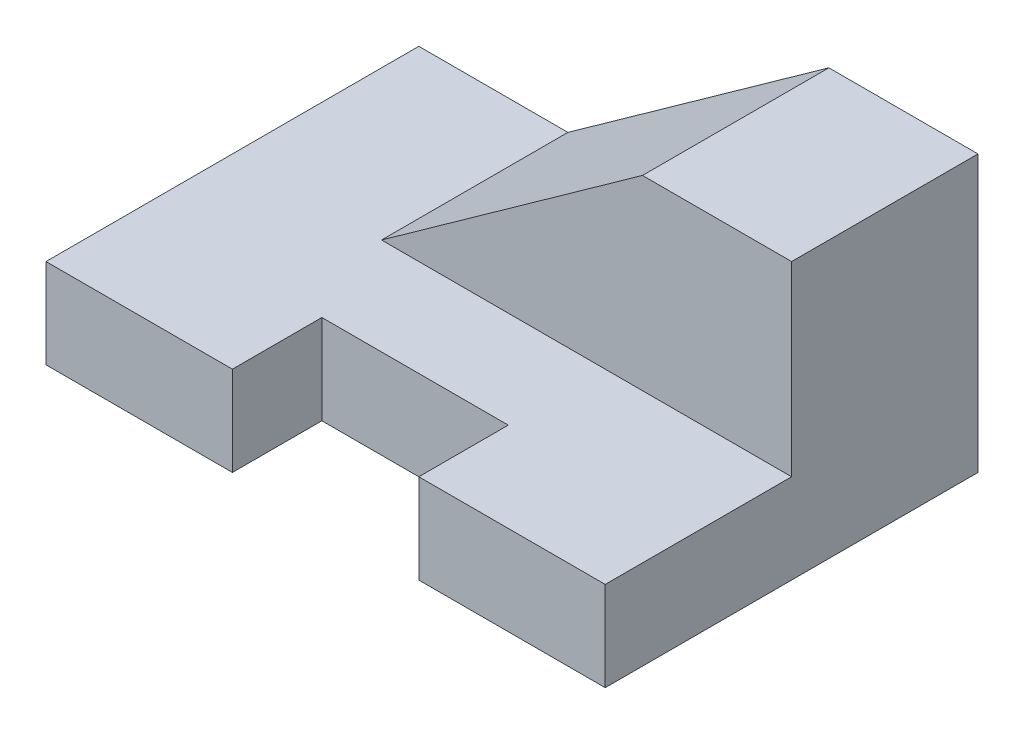
ISO-10303-21;
HEADER;
FILE_DESCRIPTION(('STEP AP214'),'2;1');
FILE_NAME('part.step','',(''),(''),'','','');
FILE_SCHEMA(('AUTOMOTIVE_DESIGN { 1 0 10303 214 1 1 1 1 }'));
ENDSEC;
DATA;
#1=APPLICATION_CONTEXT('core data for automotive mechanical design processes');
#2=APPLICATION_PROTOCOL_DEFINITION('international standard','automotive_design',2000,#1);
#3=PRODUCT_CONTEXT('',#1,'mechanical');
#4=PRODUCT('Part','Part','',(#3));
#5=PRODUCT_RELATED_PRODUCT_CATEGORY('part','',(#4));
#6=PRODUCT_DEFINITION_FORMATION('','',#4);
#7=PRODUCT_DEFINITION_CONTEXT('part definition',#1,'design');
#8=PRODUCT_DEFINITION('design','',#6,#7);
#9=PRODUCT_DEFINITION_SHAPE('','',#8);
#10=(LENGTH_UNIT() NAMED_UNIT(*) SI_UNIT(.MILLI.,.METRE.));
#11=(NAMED_UNIT(*) PLANE_ANGLE_UNIT() SI_UNIT($,.RADIAN.));
#12=(NAMED_UNIT(*) SI_UNIT($,.STERADIAN.) SOLID_ANGLE_UNIT());
#13=UNCERTAINTY_MEASURE_WITH_UNIT(LENGTH_MEASURE(1.E-05),#10,'distance_accuracy_value','');
#14=(GEOMETRIC_REPRESENTATION_CONTEXT(3) GLOBAL_UNCERTAINTY_ASSIGNED_CONTEXT((#13)) GLOBAL_UNIT_ASSIGNED_CONTEXT((#10,
#11,#12)) REPRESENTATION_CONTEXT('',''));
#15=CARTESIAN_POINT('',(0.,0.,0.));
#16=DIRECTION('',(0.,0.,1.));
#17=DIRECTION('',(1.,0.,0.));
#18=AXIS2_PLACEMENT_3D('',#15,#16,#17);
#19=CARTESIAN_POINT('',(0.,37.,25.));
#20=DIRECTION('',(0.,-1.,0.));
#21=DIRECTION('',(0.,0.,-1.));
#22=AXIS2_PLACEMENT_3D('',#19,#20,#21);
#23=PLANE('',#22);
#24=DIRECTION('',(-1.,0.,0.));
#25=VECTOR('',#24,1.);
#26=CARTESIAN_POINT('',(0.,37.,0.));
#27=LINE('',#26,#25);
#28=CARTESIAN_POINT('',(0.,37.,0.));
#29=VERTEX_POINT('',#28);
#30=CARTESIAN_POINT('',(-20.,37.,0.));
#31=VERTEX_POINT('',#30);
#32=EDGE_CURVE('E204',#29,#31,#27,.T.);
#33=ORIENTED_EDGE('',*,*,#32,.T.);
#34=DIRECTION('',(0.,0.,-1.));
#35=VECTOR('',#34,1.);
#36=CARTESIAN_POINT('',(-20.,37.,25.));
#37=LINE('',#36,#35);
#38=CARTESIAN_POINT('',(-20.,37.,25.));
#39=VERTEX_POINT('',#38);
#40=EDGE_CURVE('E11',#39,#31,#37,.T.);
#41=ORIENTED_EDGE('',*,*,#40,.F.);
#42=DIRECTION('',(-1.,0.,0.));
#43=VECTOR('',#42,1.);
#44=CARTESIAN_POINT('',(0.,37.,25.));
#45=LINE('',#44,#43);
#46=CARTESIAN_POINT('',(0.,37.,25.));
#47=VERTEX_POINT('',#46);
#48=EDGE_CURVE('E205',#47,#39,#45,.T.);
#49=ORIENTED_EDGE('',*,*,#48,.F.);
#50=DIRECTION('',(0.,0.,-1.));
#51=VECTOR('',#50,1.);
#52=CARTESIAN_POINT('',(0.,37.,25.));
#53=LINE('',#52,#51);
#54=EDGE_CURVE('E216',#47,#29,#53,.T.);
#55=ORIENTED_EDGE('',*,*,#54,.T.);
#56=EDGE_LOOP('',(#33,#41,#49,#55));
#57=FACE_BOUND('',#56,.T.);
#58=ADVANCED_FACE('F43',(#57),#23,.F.);
#59=CARTESIAN_POINT('',(-24.2567567567568,33.9594594594595,25.));
#60=DIRECTION('',(0.581238193719097,-0.813733471206735,0.));
#61=DIRECTION('',(0.813733471206735,0.581238193719097,0.));
#62=AXIS2_PLACEMENT_3D('',#59,#60,#61);
#63=PLANE('',#62);
#64=DIRECTION('',(-0.813733471206735,-0.581238193719097,0.));
#65=VECTOR('',#64,1.);
#66=CARTESIAN_POINT('',(-24.2567567567568,33.9594594594595,0.));
#67=LINE('',#66,#65);
#68=CARTESIAN_POINT('',(-55.,12.,0.));
#69=VERTEX_POINT('',#68);
#70=EDGE_CURVE('E72',#31,#69,#67,.T.);
#71=ORIENTED_EDGE('',*,*,#70,.T.);
#72=DIRECTION('',(0.,0.,-1.));
#73=VECTOR('',#72,1.);
#74=CARTESIAN_POINT('',(-55.,12.,25.));
#75=LINE('',#74,#73);
#76=CARTESIAN_POINT('',(-55.,12.,25.));
#77=VERTEX_POINT('',#76);
#78=EDGE_CURVE('E52',#77,#69,#75,.T.);
#79=ORIENTED_EDGE('',*,*,#78,.F.);
#80=DIRECTION('',(-0.813733471206735,-0.581238193719097,0.));
#81=VECTOR('',#80,1.);
#82=CARTESIAN_POINT('',(-24.2567567567568,33.9594594594595,25.));
#83=LINE('',#82,#81);
#84=EDGE_CURVE('E208',#39,#77,#83,.T.);
#85=ORIENTED_EDGE('',*,*,#84,.F.);
#86=ORIENTED_EDGE('',*,*,#40,.T.);
#87=EDGE_LOOP('',(#71,#79,#85,#86));
#88=FACE_BOUND('',#87,.T.);
#89=ADVANCED_FACE('F233',(#88),#63,.F.);
#90=CARTESIAN_POINT('',(0.,0.,25.));
#91=DIRECTION('',(-1.,0.,0.));
#92=DIRECTION('',(0.,0.,1.));
#93=AXIS2_PLACEMENT_3D('',#90,#91,#92);
#94=PLANE('',#93);
#95=DIRECTION('',(0.,1.,0.));
#96=VECTOR('',#95,1.);
#97=CARTESIAN_POINT('',(0.,0.,0.));
#98=LINE('',#97,#96);
#99=CARTESIAN_POINT('',(0.,0.,0.));
#100=VERTEX_POINT('',#99);
#101=EDGE_CURVE('E209',#100,#29,#98,.T.);
#102=ORIENTED_EDGE('',*,*,#101,.T.);
#103=ORIENTED_EDGE('',*,*,#54,.F.);
#104=DIRECTION('',(0.,1.,0.));
#105=VECTOR('',#104,1.);
#106=CARTESIAN_POINT('',(0.,0.,25.));
#107=LINE('',#106,#105);
#108=CARTESIAN_POINT('',(0.,12.,25.));
#109=VERTEX_POINT('',#108);
#110=EDGE_CURVE('E60',#109,#47,#107,.T.);
#111=ORIENTED_EDGE('',*,*,#110,.F.);
#112=DIRECTION('',(0.,0.,-1.));
#113=VECTOR('',#112,1.);
#114=CARTESIAN_POINT('',(0.,12.,50.));
#115=LINE('',#114,#113);
#116=CARTESIAN_POINT('',(0.,12.,50.));
#117=VERTEX_POINT('',#116);
#118=EDGE_CURVE('E247',#117,#109,#115,.T.);
#119=ORIENTED_EDGE('',*,*,#118,.F.);
#120=DIRECTION('',(0.,1.,0.));
#121=VECTOR('',#120,1.);
#122=CARTESIAN_POINT('',(0.,0.,50.));
#123=LINE('',#122,#121);
#124=CARTESIAN_POINT('',(0.,0.,50.));
#125=VERTEX_POINT('',#124);
#126=EDGE_CURVE('E242',#125,#117,#123,.T.);
#127=ORIENTED_EDGE('',*,*,#126,.F.);
#128=DIRECTION('',(0.,0.,-1.));
#129=VECTOR('',#128,1.);
#130=CARTESIAN_POINT('',(0.,0.,50.));
#131=LINE('',#130,#129);
#132=EDGE_CURVE('E165',#125,#100,#131,.T.);
#133=ORIENTED_EDGE('',*,*,#132,.T.);
#134=EDGE_LOOP('',(#102,#103,#111,#119,#127,#133));
#135=FACE_BOUND('',#134,.T.);
#136=ADVANCED_FACE('F240',(#135),#94,.F.);
#137=CARTESIAN_POINT('',(0.,0.,25.));
#138=DIRECTION('',(0.,0.,1.));
#139=DIRECTION('',(1.,0.,0.));
#140=AXIS2_PLACEMENT_3D('',#137,#138,#139);
#141=PLANE('',#140);
#142=ORIENTED_EDGE('',*,*,#48,.T.);
#143=ORIENTED_EDGE('',*,*,#84,.T.);
#144=DIRECTION('',(-1.,0.,0.));
#145=VECTOR('',#144,1.);
#146=CARTESIAN_POINT('',(0.,12.,25.));
#147=LINE('',#146,#145);
#148=EDGE_CURVE('E79',#109,#77,#147,.T.);
#149=ORIENTED_EDGE('',*,*,#148,.F.);
#150=ORIENTED_EDGE('',*,*,#110,.T.);
#151=EDGE_LOOP('',(#142,#143,#149,#150));
#152=FACE_BOUND('',#151,.T.);
#153=ADVANCED_FACE('F290',(#152),#141,.T.);
#154=CARTESIAN_POINT('',(0.,0.,0.));
#155=DIRECTION('',(0.,0.,1.));
#156=DIRECTION('',(1.,0.,0.));
#157=AXIS2_PLACEMENT_3D('',#154,#155,#156);
#158=PLANE('',#157);
#159=ORIENTED_EDGE('',*,*,#101,.F.);
#160=DIRECTION('',(-1.,0.,0.));
#161=VECTOR('',#160,1.);
#162=CARTESIAN_POINT('',(0.,0.,0.));
#163=LINE('',#162,#161);
#164=CARTESIAN_POINT('',(-75.,0.,0.));
#165=VERTEX_POINT('',#164);
#166=EDGE_CURVE('E174',#100,#165,#163,.T.);
#167=ORIENTED_EDGE('',*,*,#166,.T.);
#168=DIRECTION('',(0.,1.,0.));
#169=VECTOR('',#168,1.);
#170=CARTESIAN_POINT('',(-75.,0.,0.));
#171=LINE('',#170,#169);
#172=CARTESIAN_POINT('',(-75.,12.,0.));
#173=VERTEX_POINT('',#172);
#174=EDGE_CURVE('E163',#165,#173,#171,.T.);
#175=ORIENTED_EDGE('',*,*,#174,.T.);
#176=DIRECTION('',(-1.,0.,0.));
#177=VECTOR('',#176,1.);
#178=CARTESIAN_POINT('',(0.,12.,0.));
#179=LINE('',#178,#177);
#180=EDGE_CURVE('E158',#69,#173,#179,.T.);
#181=ORIENTED_EDGE('',*,*,#180,.F.);
#182=ORIENTED_EDGE('',*,*,#70,.F.);
#183=ORIENTED_EDGE('',*,*,#32,.F.);
#184=EDGE_LOOP('',(#159,#167,#175,#181,#182,#183));
#185=FACE_BOUND('',#184,.T.);
#186=ADVANCED_FACE('F231',(#185),#158,.F.);
#187=CARTESIAN_POINT('',(0.,12.,50.));
#188=DIRECTION('',(0.,-1.,0.));
#189=DIRECTION('',(1.,0.,0.));
#190=AXIS2_PLACEMENT_3D('',#187,#188,#189);
#191=PLANE('',#190);
#192=DIRECTION('',(0.,0.,-1.));
#193=VECTOR('',#192,1.);
#194=CARTESIAN_POINT('',(-50.,12.,50.));
#195=LINE('',#194,#193);
#196=CARTESIAN_POINT('',(-50.,12.,50.));
#197=VERTEX_POINT('',#196);
#198=CARTESIAN_POINT('',(-50.,12.,38.));
#199=VERTEX_POINT('',#198);
#200=EDGE_CURVE('E138',#197,#199,#195,.T.);
#201=ORIENTED_EDGE('',*,*,#200,.T.);
#202=DIRECTION('',(-1.,0.,0.));
#203=VECTOR('',#202,1.);
#204=CARTESIAN_POINT('',(0.,12.,38.));
#205=LINE('',#204,#203);
#206=CARTESIAN_POINT('',(-25.,12.,38.));
#207=VERTEX_POINT('',#206);
#208=EDGE_CURVE('E131',#207,#199,#205,.T.);
#209=ORIENTED_EDGE('',*,*,#208,.F.);
#210=DIRECTION('',(0.,0.,-1.));
#211=VECTOR('',#210,1.);
#212=CARTESIAN_POINT('',(-25.,12.,50.));
#213=LINE('',#212,#211);
#214=CARTESIAN_POINT('',(-25.,12.,50.));
#215=VERTEX_POINT('',#214);
#216=EDGE_CURVE('E136',#215,#207,#213,.T.);
#217=ORIENTED_EDGE('',*,*,#216,.F.);
#218=DIRECTION('',(-1.,0.,0.));
#219=VECTOR('',#218,1.);
#220=CARTESIAN_POINT('',(0.,12.,50.));
#221=LINE('',#220,#219);
#222=EDGE_CURVE('E258',#117,#215,#221,.T.);
#223=ORIENTED_EDGE('',*,*,#222,.F.);
#224=ORIENTED_EDGE('',*,*,#118,.T.);
#225=ORIENTED_EDGE('',*,*,#148,.T.);
#226=ORIENTED_EDGE('',*,*,#78,.T.);
#227=ORIENTED_EDGE('',*,*,#180,.T.);
#228=DIRECTION('',(0.,0.,-1.));
#229=VECTOR('',#228,1.);
#230=CARTESIAN_POINT('',(-75.,12.,50.));
#231=LINE('',#230,#229);
#232=CARTESIAN_POINT('',(-75.,12.,50.));
#233=VERTEX_POINT('',#232);
#234=EDGE_CURVE('E198',#233,#173,#231,.T.);
#235=ORIENTED_EDGE('',*,*,#234,.F.);
#236=DIRECTION('',(-1.,0.,0.));
#237=VECTOR('',#236,1.);
#238=CARTESIAN_POINT('',(0.,12.,50.));
#239=LINE('',#238,#237);
#240=EDGE_CURVE('E173',#197,#233,#239,.T.);
#241=ORIENTED_EDGE('',*,*,#240,.F.);
#242=EDGE_LOOP('',(#201,#209,#217,#223,#224,#225,#226,#227,#235,#241));
#243=FACE_BOUND('',#242,.T.);
#244=ADVANCED_FACE('F133',(#243),#191,.F.);
#245=CARTESIAN_POINT('',(-50.,0.,50.));
#246=DIRECTION('',(1.,0.,0.));
#247=DIRECTION('',(0.,0.,-1.));
#248=AXIS2_PLACEMENT_3D('',#245,#246,#247);
#249=PLANE('',#248);
#250=DIRECTION('',(0.,-1.,0.));
#251=VECTOR('',#250,1.);
#252=CARTESIAN_POINT('',(-50.,0.,38.));
#253=LINE('',#252,#251);
#254=CARTESIAN_POINT('',(-50.,0.,38.));
#255=VERTEX_POINT('',#254);
#256=EDGE_CURVE('E142',#199,#255,#253,.T.);
#257=ORIENTED_EDGE('',*,*,#256,.F.);
#258=ORIENTED_EDGE('',*,*,#200,.F.);
#259=DIRECTION('',(0.,-1.,0.));
#260=VECTOR('',#259,1.);
#261=CARTESIAN_POINT('',(-50.,0.,50.));
#262=LINE('',#261,#260);
#263=CARTESIAN_POINT('',(-50.,0.,50.));
#264=VERTEX_POINT('',#263);
#265=EDGE_CURVE('E169',#197,#264,#262,.T.);
#266=ORIENTED_EDGE('',*,*,#265,.T.);
#267=DIRECTION('',(0.,0.,-1.));
#268=VECTOR('',#267,1.);
#269=CARTESIAN_POINT('',(-50.,0.,50.));
#270=LINE('',#269,#268);
#271=EDGE_CURVE('E184',#264,#255,#270,.T.);
#272=ORIENTED_EDGE('',*,*,#271,.T.);
#273=EDGE_LOOP('',(#257,#258,#266,#272));
#274=FACE_BOUND('',#273,.T.);
#275=ADVANCED_FACE('F266',(#274),#249,.T.);
#276=CARTESIAN_POINT('',(-75.,0.,50.));
#277=DIRECTION('',(-1.,0.,0.));
#278=DIRECTION('',(0.,0.,1.));
#279=AXIS2_PLACEMENT_3D('',#276,#277,#278);
#280=PLANE('',#279);
#281=ORIENTED_EDGE('',*,*,#174,.F.);
#282=DIRECTION('',(0.,0.,-1.));
#283=VECTOR('',#282,1.);
#284=CARTESIAN_POINT('',(-75.,0.,50.));
#285=LINE('',#284,#283);
#286=CARTESIAN_POINT('',(-75.,0.,50.));
#287=VERTEX_POINT('',#286);
#288=EDGE_CURVE('E195',#287,#165,#285,.T.);
#289=ORIENTED_EDGE('',*,*,#288,.F.);
#290=DIRECTION('',(0.,1.,0.));
#291=VECTOR('',#290,1.);
#292=CARTESIAN_POINT('',(-75.,0.,50.));
#293=LINE('',#292,#291);
#294=EDGE_CURVE('E177',#287,#233,#293,.T.);
#295=ORIENTED_EDGE('',*,*,#294,.T.);
#296=ORIENTED_EDGE('',*,*,#234,.T.);
#297=EDGE_LOOP('',(#281,#289,#295,#296));
#298=FACE_BOUND('',#297,.T.);
#299=ADVANCED_FACE('F273',(#298),#280,.T.);
#300=CARTESIAN_POINT('',(0.,0.,50.));
#301=DIRECTION('',(0.,-1.,0.));
#302=DIRECTION('',(0.,0.,-1.));
#303=AXIS2_PLACEMENT_3D('',#300,#301,#302);
#304=PLANE('',#303);
#305=ORIENTED_EDGE('',*,*,#166,.F.);
#306=ORIENTED_EDGE('',*,*,#132,.F.);
#307=DIRECTION('',(-1.,0.,0.));
#308=VECTOR('',#307,1.);
#309=CARTESIAN_POINT('',(0.,0.,50.));
#310=LINE('',#309,#308);
#311=CARTESIAN_POINT('',(-25.,0.,50.));
#312=VERTEX_POINT('',#311);
#313=EDGE_CURVE('E253',#125,#312,#310,.T.);
#314=ORIENTED_EDGE('',*,*,#313,.T.);
#315=DIRECTION('',(0.,0.,-1.));
#316=VECTOR('',#315,1.);
#317=CARTESIAN_POINT('',(-25.,0.,50.));
#318=LINE('',#317,#316);
#319=CARTESIAN_POINT('',(-25.,0.,38.));
#320=VERTEX_POINT('',#319);
#321=EDGE_CURVE('E159',#312,#320,#318,.T.);
#322=ORIENTED_EDGE('',*,*,#321,.T.);
#323=DIRECTION('',(-1.,0.,0.));
#324=VECTOR('',#323,1.);
#325=CARTESIAN_POINT('',(0.,0.,38.));
#326=LINE('',#325,#324);
#327=EDGE_CURVE('E148',#320,#255,#326,.T.);
#328=ORIENTED_EDGE('',*,*,#327,.T.);
#329=ORIENTED_EDGE('',*,*,#271,.F.);
#330=DIRECTION('',(-1.,0.,0.));
#331=VECTOR('',#330,1.);
#332=CARTESIAN_POINT('',(0.,0.,50.));
#333=LINE('',#332,#331);
#334=EDGE_CURVE('E181',#264,#287,#333,.T.);
#335=ORIENTED_EDGE('',*,*,#334,.T.);
#336=ORIENTED_EDGE('',*,*,#288,.T.);
#337=EDGE_LOOP('',(#305,#306,#314,#322,#328,#329,#335,#336));
#338=FACE_BOUND('',#337,.T.);
#339=ADVANCED_FACE('F265',(#338),#304,.T.);
#340=CARTESIAN_POINT('',(0.,0.,50.));
#341=DIRECTION('',(0.,0.,1.));
#342=DIRECTION('',(1.,0.,0.));
#343=AXIS2_PLACEMENT_3D('',#340,#341,#342);
#344=PLANE('',#343);
#345=ORIENTED_EDGE('',*,*,#265,.F.);
#346=ORIENTED_EDGE('',*,*,#240,.T.);
#347=ORIENTED_EDGE('',*,*,#294,.F.);
#348=ORIENTED_EDGE('',*,*,#334,.F.);
#349=EDGE_LOOP('',(#345,#346,#347,#348));
#350=FACE_BOUND('',#349,.T.);
#351=ADVANCED_FACE('F271',(#350),#344,.T.);
#352=CARTESIAN_POINT('',(-25.,0.,50.));
#353=DIRECTION('',(1.,0.,0.));
#354=DIRECTION('',(0.,0.,-1.));
#355=AXIS2_PLACEMENT_3D('',#352,#353,#354);
#356=PLANE('',#355);
#357=ORIENTED_EDGE('',*,*,#216,.T.);
#358=DIRECTION('',(0.,-1.,0.));
#359=VECTOR('',#358,1.);
#360=CARTESIAN_POINT('',(-25.,0.,38.));
#361=LINE('',#360,#359);
#362=EDGE_CURVE('E143',#207,#320,#361,.T.);
#363=ORIENTED_EDGE('',*,*,#362,.T.);
#364=ORIENTED_EDGE('',*,*,#321,.F.);
#365=DIRECTION('',(0.,-1.,0.));
#366=VECTOR('',#365,1.);
#367=CARTESIAN_POINT('',(-25.,0.,50.));
#368=LINE('',#367,#366);
#369=EDGE_CURVE('E155',#215,#312,#368,.T.);
#370=ORIENTED_EDGE('',*,*,#369,.F.);
#371=EDGE_LOOP('',(#357,#363,#364,#370));
#372=FACE_BOUND('',#371,.T.);
#373=ADVANCED_FACE('F154',(#372),#356,.F.);
#374=CARTESIAN_POINT('',(0.,0.,50.));
#375=DIRECTION('',(0.,0.,1.));
#376=DIRECTION('',(1.,0.,0.));
#377=AXIS2_PLACEMENT_3D('',#374,#375,#376);
#378=PLANE('',#377);
#379=ORIENTED_EDGE('',*,*,#222,.T.);
#380=ORIENTED_EDGE('',*,*,#369,.T.);
#381=ORIENTED_EDGE('',*,*,#313,.F.);
#382=ORIENTED_EDGE('',*,*,#126,.T.);
#383=EDGE_LOOP('',(#379,#380,#381,#382));
#384=FACE_BOUND('',#383,.T.);
#385=ADVANCED_FACE('F326',(#384),#378,.T.);
#386=CARTESIAN_POINT('',(0.,0.,38.));
#387=DIRECTION('',(0.,0.,1.));
#388=DIRECTION('',(1.,0.,0.));
#389=AXIS2_PLACEMENT_3D('',#386,#387,#388);
#390=PLANE('',#389);
#391=ORIENTED_EDGE('',*,*,#362,.F.);
#392=ORIENTED_EDGE('',*,*,#208,.T.);
#393=ORIENTED_EDGE('',*,*,#256,.T.);
#394=ORIENTED_EDGE('',*,*,#327,.F.);
#395=EDGE_LOOP('',(#391,#392,#393,#394));
#396=FACE_BOUND('',#395,.T.);
#397=ADVANCED_FACE('F146',(#396),#390,.T.);
#398=CLOSED_SHELL('',(#58,#89,#136,#153,#186,#244,#275,#299,#339,#351,#373,#385,#397));
#399=MANIFOLD_SOLID_BREP('B2',#398);
#400=ADVANCED_BREP_SHAPE_REPRESENTATION('',(#18,#399),#14);
#401=SHAPE_DEFINITION_REPRESENTATION(#9,#400);
ENDSEC;
END-ISO-10303-21;
